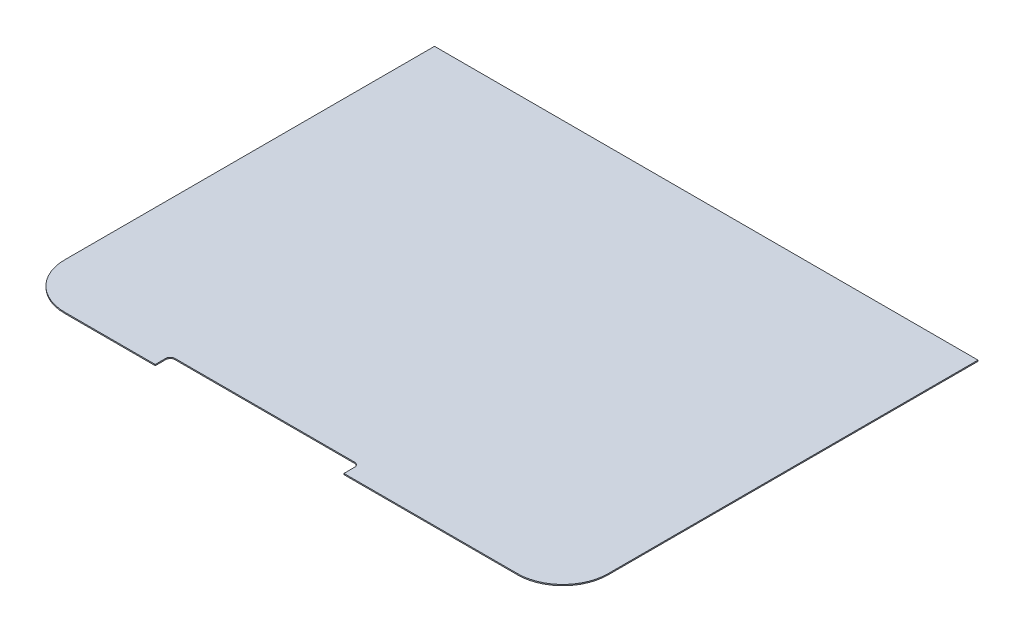
ISO-10303-21;
HEADER;
FILE_DESCRIPTION(('STEP AP214'),'2;1');
FILE_NAME('part.step','',(''),(''),'','','');
FILE_SCHEMA(('AUTOMOTIVE_DESIGN { 1 0 10303 214 1 1 1 1 }'));
ENDSEC;
DATA;
#1=APPLICATION_CONTEXT('core data for automotive mechanical design processes');
#2=APPLICATION_PROTOCOL_DEFINITION('international standard','automotive_design',2000,#1);
#3=PRODUCT_CONTEXT('',#1,'mechanical');
#4=PRODUCT('Part','Part','',(#3));
#5=PRODUCT_RELATED_PRODUCT_CATEGORY('part','',(#4));
#6=PRODUCT_DEFINITION_FORMATION('','',#4);
#7=PRODUCT_DEFINITION_CONTEXT('part definition',#1,'design');
#8=PRODUCT_DEFINITION('design','',#6,#7);
#9=PRODUCT_DEFINITION_SHAPE('','',#8);
#10=(LENGTH_UNIT() NAMED_UNIT(*) SI_UNIT(.MILLI.,.METRE.));
#11=(NAMED_UNIT(*) PLANE_ANGLE_UNIT() SI_UNIT($,.RADIAN.));
#12=(NAMED_UNIT(*) SI_UNIT($,.STERADIAN.) SOLID_ANGLE_UNIT());
#13=UNCERTAINTY_MEASURE_WITH_UNIT(LENGTH_MEASURE(1.E-05),#10,'distance_accuracy_value','');
#14=(GEOMETRIC_REPRESENTATION_CONTEXT(3) GLOBAL_UNCERTAINTY_ASSIGNED_CONTEXT((#13)) GLOBAL_UNIT_ASSIGNED_CONTEXT((#10,
#11,#12)) REPRESENTATION_CONTEXT('',''));
#15=CARTESIAN_POINT('',(0.,0.,0.));
#16=DIRECTION('',(0.,0.,1.));
#17=DIRECTION('',(1.,0.,0.));
#18=AXIS2_PLACEMENT_3D('',#15,#16,#17);
#19=CARTESIAN_POINT('',(150.,-2.50971387345089,-117.5));
#20=DIRECTION('',(-1.,0.,0.));
#21=DIRECTION('',(0.,0.,1.));
#22=AXIS2_PLACEMENT_3D('',#19,#20,#21);
#23=CYLINDRICAL_SURFACE('',#22,1.00971387345089);
#24=CARTESIAN_POINT('',(-150.,-2.50971387345089,-117.5));
#25=DIRECTION('',(1.,0.,0.));
#26=DIRECTION('',(0.,0.,-1.));
#27=AXIS2_PLACEMENT_3D('',#24,#25,#26);
#28=CIRCLE('',#27,1.00971387345089);
#29=CARTESIAN_POINT('',(-150.,-1.5,-117.5));
#30=VERTEX_POINT('',#29);
#31=CARTESIAN_POINT('',(-150.,-2.1643713897353,-116.551179324013));
#32=VERTEX_POINT('',#31);
#33=EDGE_CURVE('E110',#30,#32,#28,.F.);
#34=ORIENTED_EDGE('',*,*,#33,.T.);
#35=DIRECTION('',(-1.,0.,0.));
#36=VECTOR('',#35,1.);
#37=CARTESIAN_POINT('',(150.,-2.1643713897353,-116.551179324013));
#38=LINE('',#37,#36);
#39=CARTESIAN_POINT('',(150.,-2.1643713897353,-116.551179324013));
#40=VERTEX_POINT('',#39);
#41=EDGE_CURVE('E12',#40,#32,#38,.T.);
#42=ORIENTED_EDGE('',*,*,#41,.F.);
#43=CARTESIAN_POINT('',(150.,-2.50971387345089,-117.5));
#44=DIRECTION('',(1.,0.,0.));
#45=DIRECTION('',(0.,0.,-1.));
#46=AXIS2_PLACEMENT_3D('',#43,#44,#45);
#47=CIRCLE('',#46,1.00971387345089);
#48=CARTESIAN_POINT('',(150.,-1.5,-117.5));
#49=VERTEX_POINT('',#48);
#50=EDGE_CURVE('E86',#49,#40,#47,.F.);
#51=ORIENTED_EDGE('',*,*,#50,.F.);
#52=DIRECTION('',(-1.,0.,0.));
#53=VECTOR('',#52,1.);
#54=CARTESIAN_POINT('',(150.,-1.5,-117.5));
#55=LINE('',#54,#53);
#56=EDGE_CURVE('E62',#49,#30,#55,.T.);
#57=ORIENTED_EDGE('',*,*,#56,.T.);
#58=EDGE_LOOP('',(#34,#42,#51,#57));
#59=FACE_BOUND('',#58,.T.);
#60=ADVANCED_FACE('F46',(#59),#23,.F.);
#61=CARTESIAN_POINT('',(150.,-1.90785628224105,-115.846409858424));
#62=DIRECTION('',(0.,0.93969262078591,-0.342020143325665));
#63=DIRECTION('',(0.,0.342020143325665,0.93969262078591));
#64=AXIS2_PLACEMENT_3D('',#61,#62,#63);
#65=PLANE('',#64);
#66=DIRECTION('',(0.,-0.342020143325665,-0.93969262078591));
#67=VECTOR('',#66,1.);
#68=CARTESIAN_POINT('',(-150.,-1.90785628224105,-115.846409858424));
#69=LINE('',#68,#67);
#70=CARTESIAN_POINT('',(-150.,-1.90785628224105,-115.846409858424));
#71=VERTEX_POINT('',#70);
#72=EDGE_CURVE('E103',#71,#32,#69,.T.);
#73=ORIENTED_EDGE('',*,*,#72,.F.);
#74=DIRECTION('',(-1.,0.,0.));
#75=VECTOR('',#74,1.);
#76=CARTESIAN_POINT('',(150.,-1.90785628224105,-115.846409858424));
#77=LINE('',#76,#75);
#78=CARTESIAN_POINT('',(150.,-1.90785628224105,-115.846409858424));
#79=VERTEX_POINT('',#78);
#80=EDGE_CURVE('E54',#79,#71,#77,.T.);
#81=ORIENTED_EDGE('',*,*,#80,.F.);
#82=DIRECTION('',(0.,-0.342020143325665,-0.93969262078591));
#83=VECTOR('',#82,1.);
#84=CARTESIAN_POINT('',(150.,-1.90785628224105,-115.846409858424));
#85=LINE('',#84,#83);
#86=EDGE_CURVE('E97',#79,#40,#85,.T.);
#87=ORIENTED_EDGE('',*,*,#86,.T.);
#88=ORIENTED_EDGE('',*,*,#41,.T.);
#89=EDGE_LOOP('',(#73,#81,#87,#88));
#90=FACE_BOUND('',#89,.T.);
#91=ADVANCED_FACE('F101',(#90),#65,.T.);
#92=CARTESIAN_POINT('',(150.,-2.50971387345089,-117.5));
#93=DIRECTION('',(-1.,0.,0.));
#94=DIRECTION('',(0.,0.,1.));
#95=AXIS2_PLACEMENT_3D('',#92,#93,#94);
#96=CYLINDRICAL_SURFACE('',#95,1.75971387345089);
#97=CARTESIAN_POINT('',(-150.,-2.50971387345089,-117.5));
#98=DIRECTION('',(-1.,0.,0.));
#99=DIRECTION('',(0.,0.,1.));
#100=AXIS2_PLACEMENT_3D('',#97,#98,#99);
#101=CIRCLE('',#100,1.75971387345089);
#102=CARTESIAN_POINT('',(-150.,-0.750000000000003,-117.5));
#103=VERTEX_POINT('',#102);
#104=EDGE_CURVE('E113',#103,#71,#101,.T.);
#105=ORIENTED_EDGE('',*,*,#104,.F.);
#106=DIRECTION('',(-1.,0.,0.));
#107=VECTOR('',#106,1.);
#108=CARTESIAN_POINT('',(150.,-0.750000000000003,-117.5));
#109=LINE('',#108,#107);
#110=CARTESIAN_POINT('',(150.,-0.750000000000003,-117.5));
#111=VERTEX_POINT('',#110);
#112=EDGE_CURVE('E76',#111,#103,#109,.T.);
#113=ORIENTED_EDGE('',*,*,#112,.F.);
#114=CARTESIAN_POINT('',(150.,-2.50971387345089,-117.5));
#115=DIRECTION('',(-1.,0.,0.));
#116=DIRECTION('',(0.,0.,1.));
#117=AXIS2_PLACEMENT_3D('',#114,#115,#116);
#118=CIRCLE('',#117,1.75971387345089);
#119=EDGE_CURVE('E92',#111,#79,#118,.T.);
#120=ORIENTED_EDGE('',*,*,#119,.T.);
#121=ORIENTED_EDGE('',*,*,#80,.T.);
#122=EDGE_LOOP('',(#105,#113,#120,#121));
#123=FACE_BOUND('',#122,.T.);
#124=ADVANCED_FACE('F94',(#123),#96,.T.);
#125=CARTESIAN_POINT('',(150.,-1.5,-117.5));
#126=DIRECTION('',(0.,0.,1.));
#127=DIRECTION('',(1.,0.,0.));
#128=AXIS2_PLACEMENT_3D('',#125,#126,#127);
#129=PLANE('',#128);
#130=DIRECTION('',(0.,1.,0.));
#131=VECTOR('',#130,1.);
#132=CARTESIAN_POINT('',(-150.,-1.5,-117.5));
#133=LINE('',#132,#131);
#134=EDGE_CURVE('E106',#30,#103,#133,.T.);
#135=ORIENTED_EDGE('',*,*,#134,.F.);
#136=ORIENTED_EDGE('',*,*,#56,.F.);
#137=DIRECTION('',(0.,1.,0.));
#138=VECTOR('',#137,1.);
#139=CARTESIAN_POINT('',(150.,-1.5,-117.5));
#140=LINE('',#139,#138);
#141=EDGE_CURVE('E96',#49,#111,#140,.T.);
#142=ORIENTED_EDGE('',*,*,#141,.T.);
#143=ORIENTED_EDGE('',*,*,#112,.T.);
#144=EDGE_LOOP('',(#135,#136,#142,#143));
#145=FACE_BOUND('',#144,.T.);
#146=ADVANCED_FACE('F120',(#145),#129,.T.);
#147=CARTESIAN_POINT('',(150.,-2.50971387345089,-117.5));
#148=DIRECTION('',(1.,0.,0.));
#149=DIRECTION('',(0.,0.,-1.));
#150=AXIS2_PLACEMENT_3D('',#147,#148,#149);
#151=PLANE('',#150);
#152=ORIENTED_EDGE('',*,*,#50,.T.);
#153=ORIENTED_EDGE('',*,*,#86,.F.);
#154=ORIENTED_EDGE('',*,*,#119,.F.);
#155=ORIENTED_EDGE('',*,*,#141,.F.);
#156=EDGE_LOOP('',(#152,#153,#154,#155));
#157=FACE_BOUND('',#156,.T.);
#158=ADVANCED_FACE('F104',(#157),#151,.T.);
#159=CARTESIAN_POINT('',(-150.,-2.50971387345089,-117.5));
#160=DIRECTION('',(1.,0.,0.));
#161=DIRECTION('',(0.,0.,-1.));
#162=AXIS2_PLACEMENT_3D('',#159,#160,#161);
#163=PLANE('',#162);
#164=ORIENTED_EDGE('',*,*,#104,.T.);
#165=ORIENTED_EDGE('',*,*,#72,.T.);
#166=ORIENTED_EDGE('',*,*,#33,.F.);
#167=ORIENTED_EDGE('',*,*,#134,.T.);
#168=EDGE_LOOP('',(#164,#165,#166,#167));
#169=FACE_BOUND('',#168,.T.);
#170=ADVANCED_FACE('F119',(#169),#163,.F.);
#171=CLOSED_SHELL('',(#60,#91,#124,#146,#158,#170));
#172=MANIFOLD_SOLID_BREP('B2',#171);
#173=CARTESIAN_POINT('',(180.,-0.75,157.5));
#174=DIRECTION('',(0.,0.,1.));
#175=DIRECTION('',(1.,0.,0.));
#176=AXIS2_PLACEMENT_3D('',#173,#174,#175);
#177=PLANE('',#176);
#178=DIRECTION('',(0.,1.,0.));
#179=VECTOR('',#178,1.);
#180=CARTESIAN_POINT('',(-90.,-10.,157.5));
#181=LINE('',#180,#179);
#182=CARTESIAN_POINT('',(-90.,-0.750000000000001,157.5));
#183=VERTEX_POINT('',#182);
#184=CARTESIAN_POINT('',(-90.,0.,157.5));
#185=VERTEX_POINT('',#184);
#186=EDGE_CURVE('E345',#183,#185,#181,.T.);
#187=ORIENTED_EDGE('',*,*,#186,.T.);
#188=DIRECTION('',(1.,0.,0.));
#189=VECTOR('',#188,1.);
#190=CARTESIAN_POINT('',(180.,0.,157.5));
#191=LINE('',#190,#189);
#192=CARTESIAN_POINT('',(-150.,0.,157.5));
#193=VERTEX_POINT('',#192);
#194=EDGE_CURVE('E291',#193,#185,#191,.T.);
#195=ORIENTED_EDGE('',*,*,#194,.F.);
#196=DIRECTION('',(0.,1.,0.));
#197=VECTOR('',#196,1.);
#198=CARTESIAN_POINT('',(-150.,-0.75,157.5));
#199=LINE('',#198,#197);
#200=CARTESIAN_POINT('',(-150.,-0.75,157.5));
#201=VERTEX_POINT('',#200);
#202=EDGE_CURVE('E309',#193,#201,#199,.F.);
#203=ORIENTED_EDGE('',*,*,#202,.T.);
#204=DIRECTION('',(1.,0.,0.));
#205=VECTOR('',#204,1.);
#206=CARTESIAN_POINT('',(180.,-0.75,157.5));
#207=LINE('',#206,#205);
#208=EDGE_CURVE('E322',#201,#183,#207,.T.);
#209=ORIENTED_EDGE('',*,*,#208,.T.);
#210=EDGE_LOOP('',(#187,#195,#203,#209));
#211=FACE_BOUND('',#210,.T.);
#212=ADVANCED_FACE('F181',(#211),#177,.T.);
#213=CARTESIAN_POINT('',(-180.,-0.75,157.5));
#214=DIRECTION('',(-1.,0.,0.));
#215=DIRECTION('',(0.,0.,1.));
#216=AXIS2_PLACEMENT_3D('',#213,#214,#215);
#217=PLANE('',#216);
#218=DIRECTION('',(0.,1.,0.));
#219=VECTOR('',#218,1.);
#220=CARTESIAN_POINT('',(-180.,-10.,-117.5));
#221=LINE('',#220,#219);
#222=CARTESIAN_POINT('',(-180.,-0.750000000000001,-117.5));
#223=VERTEX_POINT('',#222);
#224=CARTESIAN_POINT('',(-180.,0.,-117.5));
#225=VERTEX_POINT('',#224);
#226=EDGE_CURVE('E276',#223,#225,#221,.T.);
#227=ORIENTED_EDGE('',*,*,#226,.F.);
#228=DIRECTION('',(0.,0.,1.));
#229=VECTOR('',#228,1.);
#230=CARTESIAN_POINT('',(-180.,-0.75,157.5));
#231=LINE('',#230,#229);
#232=CARTESIAN_POINT('',(-180.,-0.75,127.5));
#233=VERTEX_POINT('',#232);
#234=EDGE_CURVE('E290',#223,#233,#231,.T.);
#235=ORIENTED_EDGE('',*,*,#234,.T.);
#236=DIRECTION('',(0.,1.,0.));
#237=VECTOR('',#236,1.);
#238=CARTESIAN_POINT('',(-180.,-0.75,127.5));
#239=LINE('',#238,#237);
#240=CARTESIAN_POINT('',(-180.,0.,127.5));
#241=VERTEX_POINT('',#240);
#242=EDGE_CURVE('E300',#233,#241,#239,.T.);
#243=ORIENTED_EDGE('',*,*,#242,.T.);
#244=DIRECTION('',(0.,0.,1.));
#245=VECTOR('',#244,1.);
#246=CARTESIAN_POINT('',(-180.,0.,157.5));
#247=LINE('',#246,#245);
#248=EDGE_CURVE('E329',#225,#241,#247,.T.);
#249=ORIENTED_EDGE('',*,*,#248,.F.);
#250=EDGE_LOOP('',(#227,#235,#243,#249));
#251=FACE_BOUND('',#250,.T.);
#252=ADVANCED_FACE('F328',(#251),#217,.T.);
#253=CARTESIAN_POINT('',(180.,-0.75,157.5));
#254=DIRECTION('',(1.,0.,0.));
#255=DIRECTION('',(0.,0.,-1.));
#256=AXIS2_PLACEMENT_3D('',#253,#254,#255);
#257=PLANE('',#256);
#258=DIRECTION('',(0.,1.,0.));
#259=VECTOR('',#258,1.);
#260=CARTESIAN_POINT('',(180.,-10.,-117.5));
#261=LINE('',#260,#259);
#262=CARTESIAN_POINT('',(180.,-0.750000000000001,-117.5));
#263=VERTEX_POINT('',#262);
#264=CARTESIAN_POINT('',(180.,0.,-117.5));
#265=VERTEX_POINT('',#264);
#266=EDGE_CURVE('E274',#263,#265,#261,.T.);
#267=ORIENTED_EDGE('',*,*,#266,.T.);
#268=DIRECTION('',(0.,0.,-1.));
#269=VECTOR('',#268,1.);
#270=CARTESIAN_POINT('',(180.,0.,157.5));
#271=LINE('',#270,#269);
#272=CARTESIAN_POINT('',(180.,0.,127.5));
#273=VERTEX_POINT('',#272);
#274=EDGE_CURVE('E284',#273,#265,#271,.T.);
#275=ORIENTED_EDGE('',*,*,#274,.F.);
#276=DIRECTION('',(0.,1.,0.));
#277=VECTOR('',#276,1.);
#278=CARTESIAN_POINT('',(180.,-0.75,127.5));
#279=LINE('',#278,#277);
#280=CARTESIAN_POINT('',(180.,-0.75,127.5));
#281=VERTEX_POINT('',#280);
#282=EDGE_CURVE('E44',#273,#281,#279,.F.);
#283=ORIENTED_EDGE('',*,*,#282,.T.);
#284=DIRECTION('',(0.,0.,-1.));
#285=VECTOR('',#284,1.);
#286=CARTESIAN_POINT('',(180.,-0.75,157.5));
#287=LINE('',#286,#285);
#288=EDGE_CURVE('E285',#281,#263,#287,.T.);
#289=ORIENTED_EDGE('',*,*,#288,.T.);
#290=EDGE_LOOP('',(#267,#275,#283,#289));
#291=FACE_BOUND('',#290,.T.);
#292=ADVANCED_FACE('F283',(#291),#257,.T.);
#293=DIRECTION('',(0.,1.,0.));
#294=VECTOR('',#293,1.);
#295=CARTESIAN_POINT('',(35.,-10.,157.5));
#296=LINE('',#295,#294);
#297=CARTESIAN_POINT('',(35.,-0.750000000000001,157.5));
#298=VERTEX_POINT('',#297);
#299=CARTESIAN_POINT('',(35.0000000000001,0.,157.5));
#300=VERTEX_POINT('',#299);
#301=EDGE_CURVE('E196',#298,#300,#296,.T.);
#302=ORIENTED_EDGE('',*,*,#301,.F.);
#303=CARTESIAN_POINT('',(150.,-0.75,157.5));
#304=VERTEX_POINT('',#303);
#305=EDGE_CURVE('E293',#298,#304,#207,.T.);
#306=ORIENTED_EDGE('',*,*,#305,.T.);
#307=DIRECTION('',(0.,1.,0.));
#308=VECTOR('',#307,1.);
#309=CARTESIAN_POINT('',(150.,-0.75,157.5));
#310=LINE('',#309,#308);
#311=CARTESIAN_POINT('',(150.,0.,157.5));
#312=VERTEX_POINT('',#311);
#313=EDGE_CURVE('E306',#304,#312,#310,.T.);
#314=ORIENTED_EDGE('',*,*,#313,.T.);
#315=EDGE_CURVE('E296',#300,#312,#191,.T.);
#316=ORIENTED_EDGE('',*,*,#315,.F.);
#317=EDGE_LOOP('',(#302,#306,#314,#316));
#318=FACE_BOUND('',#317,.T.);
#319=ADVANCED_FACE('F378',(#318),#177,.T.);
#320=CARTESIAN_POINT('',(0.,-0.75,0.));
#321=DIRECTION('',(0.,1.,0.));
#322=DIRECTION('',(0.,0.,1.));
#323=AXIS2_PLACEMENT_3D('',#320,#321,#322);
#324=PLANE('',#323);
#325=DIRECTION('',(1.,0.,0.));
#326=VECTOR('',#325,1.);
#327=CARTESIAN_POINT('',(0.,-0.75,-117.5));
#328=LINE('',#327,#326);
#329=EDGE_CURVE('E280',#223,#263,#328,.T.);
#330=ORIENTED_EDGE('',*,*,#329,.T.);
#331=ORIENTED_EDGE('',*,*,#288,.F.);
#332=CARTESIAN_POINT('',(150.,-0.75,127.5));
#333=DIRECTION('',(0.,1.,0.));
#334=DIRECTION('',(0.,0.,1.));
#335=AXIS2_PLACEMENT_3D('',#332,#333,#334);
#336=CIRCLE('',#335,30.);
#337=EDGE_CURVE('E311',#281,#304,#336,.F.);
#338=ORIENTED_EDGE('',*,*,#337,.T.);
#339=ORIENTED_EDGE('',*,*,#305,.F.);
#340=DIRECTION('',(0.,0.,-1.));
#341=VECTOR('',#340,1.);
#342=CARTESIAN_POINT('',(35.,-0.75,0.));
#343=LINE('',#342,#341);
#344=CARTESIAN_POINT('',(35.,-0.750000000000001,150.5));
#345=VERTEX_POINT('',#344);
#346=EDGE_CURVE('E348',#298,#345,#343,.T.);
#347=ORIENTED_EDGE('',*,*,#346,.T.);
#348=CARTESIAN_POINT('',(32.,-0.750000000000001,150.5));
#349=DIRECTION('',(0.,1.,0.));
#350=DIRECTION('',(0.,0.,1.));
#351=AXIS2_PLACEMENT_3D('',#348,#349,#350);
#352=CIRCLE('',#351,3.);
#353=CARTESIAN_POINT('',(32.,-0.750000000000001,147.5));
#354=VERTEX_POINT('',#353);
#355=EDGE_CURVE('E360',#345,#354,#352,.T.);
#356=ORIENTED_EDGE('',*,*,#355,.T.);
#357=DIRECTION('',(-1.,0.,0.));
#358=VECTOR('',#357,1.);
#359=CARTESIAN_POINT('',(0.,-0.75,147.5));
#360=LINE('',#359,#358);
#361=CARTESIAN_POINT('',(-87.,-0.750000000000001,147.5));
#362=VERTEX_POINT('',#361);
#363=EDGE_CURVE('E363',#354,#362,#360,.T.);
#364=ORIENTED_EDGE('',*,*,#363,.T.);
#365=CARTESIAN_POINT('',(-87.,-0.750000000000001,150.5));
#366=DIRECTION('',(0.,1.,0.));
#367=DIRECTION('',(0.,0.,1.));
#368=AXIS2_PLACEMENT_3D('',#365,#366,#367);
#369=CIRCLE('',#368,3.);
#370=CARTESIAN_POINT('',(-90.,-0.750000000000001,150.5));
#371=VERTEX_POINT('',#370);
#372=EDGE_CURVE('E366',#362,#371,#369,.T.);
#373=ORIENTED_EDGE('',*,*,#372,.T.);
#374=DIRECTION('',(0.,0.,1.));
#375=VECTOR('',#374,1.);
#376=CARTESIAN_POINT('',(-90.,-0.75,0.));
#377=LINE('',#376,#375);
#378=EDGE_CURVE('E281',#371,#183,#377,.T.);
#379=ORIENTED_EDGE('',*,*,#378,.T.);
#380=ORIENTED_EDGE('',*,*,#208,.F.);
#381=CARTESIAN_POINT('',(-150.,-0.75,127.5));
#382=DIRECTION('',(0.,1.,0.));
#383=DIRECTION('',(0.,0.,1.));
#384=AXIS2_PLACEMENT_3D('',#381,#382,#383);
#385=CIRCLE('',#384,30.);
#386=EDGE_CURVE('E189',#201,#233,#385,.F.);
#387=ORIENTED_EDGE('',*,*,#386,.T.);
#388=ORIENTED_EDGE('',*,*,#234,.F.);
#389=EDGE_LOOP('',(#330,#331,#338,#339,#347,#356,#364,#373,#379,#380,#387,#388));
#390=FACE_BOUND('',#389,.T.);
#391=ADVANCED_FACE('F319',(#390),#324,.F.);
#392=CARTESIAN_POINT('',(0.,0.,0.));
#393=DIRECTION('',(0.,1.,0.));
#394=DIRECTION('',(0.,0.,1.));
#395=AXIS2_PLACEMENT_3D('',#392,#393,#394);
#396=PLANE('',#395);
#397=ORIENTED_EDGE('',*,*,#274,.T.);
#398=DIRECTION('',(1.,0.,0.));
#399=VECTOR('',#398,1.);
#400=CARTESIAN_POINT('',(-150.,0.,-117.5));
#401=LINE('',#400,#399);
#402=EDGE_CURVE('E271',#225,#265,#401,.T.);
#403=ORIENTED_EDGE('',*,*,#402,.F.);
#404=ORIENTED_EDGE('',*,*,#248,.T.);
#405=CARTESIAN_POINT('',(-150.,0.,127.5));
#406=DIRECTION('',(0.,1.,0.));
#407=DIRECTION('',(0.,0.,1.));
#408=AXIS2_PLACEMENT_3D('',#405,#406,#407);
#409=CIRCLE('',#408,30.);
#410=EDGE_CURVE('E304',#241,#193,#409,.T.);
#411=ORIENTED_EDGE('',*,*,#410,.T.);
#412=ORIENTED_EDGE('',*,*,#194,.T.);
#413=DIRECTION('',(0.,0.,1.));
#414=VECTOR('',#413,1.);
#415=CARTESIAN_POINT('',(-90.,0.,157.5));
#416=LINE('',#415,#414);
#417=CARTESIAN_POINT('',(-90.,0.,150.5));
#418=VERTEX_POINT('',#417);
#419=EDGE_CURVE('E343',#418,#185,#416,.T.);
#420=ORIENTED_EDGE('',*,*,#419,.F.);
#421=CARTESIAN_POINT('',(-87.,0.,150.5));
#422=DIRECTION('',(0.,1.,0.));
#423=DIRECTION('',(0.,0.,-1.));
#424=AXIS2_PLACEMENT_3D('',#421,#422,#423);
#425=CIRCLE('',#424,3.);
#426=CARTESIAN_POINT('',(-87.,0.,147.5));
#427=VERTEX_POINT('',#426);
#428=EDGE_CURVE('E340',#427,#418,#425,.T.);
#429=ORIENTED_EDGE('',*,*,#428,.F.);
#430=DIRECTION('',(-1.,0.,0.));
#431=VECTOR('',#430,1.);
#432=CARTESIAN_POINT('',(-87.,0.,147.5));
#433=LINE('',#432,#431);
#434=CARTESIAN_POINT('',(32.,0.,147.5));
#435=VERTEX_POINT('',#434);
#436=EDGE_CURVE('E337',#435,#427,#433,.T.);
#437=ORIENTED_EDGE('',*,*,#436,.F.);
#438=CARTESIAN_POINT('',(32.,0.,150.5));
#439=DIRECTION('',(0.,1.,0.));
#440=DIRECTION('',(0.,0.,-1.));
#441=AXIS2_PLACEMENT_3D('',#438,#439,#440);
#442=CIRCLE('',#441,3.);
#443=CARTESIAN_POINT('',(35.,0.,150.5));
#444=VERTEX_POINT('',#443);
#445=EDGE_CURVE('E332',#444,#435,#442,.T.);
#446=ORIENTED_EDGE('',*,*,#445,.F.);
#447=DIRECTION('',(0.,0.,-1.));
#448=VECTOR('',#447,1.);
#449=CARTESIAN_POINT('',(35.,0.,150.5));
#450=LINE('',#449,#448);
#451=EDGE_CURVE('E330',#300,#444,#450,.T.);
#452=ORIENTED_EDGE('',*,*,#451,.F.);
#453=ORIENTED_EDGE('',*,*,#315,.T.);
#454=CARTESIAN_POINT('',(150.,0.,127.5));
#455=DIRECTION('',(0.,1.,0.));
#456=DIRECTION('',(0.,0.,1.));
#457=AXIS2_PLACEMENT_3D('',#454,#455,#456);
#458=CIRCLE('',#457,30.);
#459=EDGE_CURVE('E289',#312,#273,#458,.T.);
#460=ORIENTED_EDGE('',*,*,#459,.T.);
#461=EDGE_LOOP('',(#397,#403,#404,#411,#412,#420,#429,#437,#446,#452,#453,#460));
#462=FACE_BOUND('',#461,.T.);
#463=ADVANCED_FACE('F287',(#462),#396,.T.);
#464=CARTESIAN_POINT('',(-150.,-0.75,127.5));
#465=DIRECTION('',(0.,1.,0.));
#466=DIRECTION('',(0.,0.,1.));
#467=AXIS2_PLACEMENT_3D('',#464,#465,#466);
#468=CYLINDRICAL_SURFACE('',#467,30.);
#469=ORIENTED_EDGE('',*,*,#386,.F.);
#470=ORIENTED_EDGE('',*,*,#202,.F.);
#471=ORIENTED_EDGE('',*,*,#410,.F.);
#472=ORIENTED_EDGE('',*,*,#242,.F.);
#473=EDGE_LOOP('',(#469,#470,#471,#472));
#474=FACE_BOUND('',#473,.T.);
#475=ADVANCED_FACE('F326',(#474),#468,.T.);
#476=CARTESIAN_POINT('',(150.,-0.75,127.5));
#477=DIRECTION('',(0.,1.,0.));
#478=DIRECTION('',(0.,0.,1.));
#479=AXIS2_PLACEMENT_3D('',#476,#477,#478);
#480=CYLINDRICAL_SURFACE('',#479,30.);
#481=ORIENTED_EDGE('',*,*,#337,.F.);
#482=ORIENTED_EDGE('',*,*,#282,.F.);
#483=ORIENTED_EDGE('',*,*,#459,.F.);
#484=ORIENTED_EDGE('',*,*,#313,.F.);
#485=EDGE_LOOP('',(#481,#482,#483,#484));
#486=FACE_BOUND('',#485,.T.);
#487=ADVANCED_FACE('F183',(#486),#480,.T.);
#488=CARTESIAN_POINT('',(-150.,-10.,-117.5));
#489=DIRECTION('',(0.,0.,1.));
#490=DIRECTION('',(1.,0.,0.));
#491=AXIS2_PLACEMENT_3D('',#488,#489,#490);
#492=PLANE('',#491);
#493=ORIENTED_EDGE('',*,*,#329,.F.);
#494=ORIENTED_EDGE('',*,*,#226,.T.);
#495=ORIENTED_EDGE('',*,*,#402,.T.);
#496=ORIENTED_EDGE('',*,*,#266,.F.);
#497=EDGE_LOOP('',(#493,#494,#495,#496));
#498=FACE_BOUND('',#497,.T.);
#499=ADVANCED_FACE('F273',(#498),#492,.F.);
#500=CARTESIAN_POINT('',(-90.,-10.,157.5));
#501=DIRECTION('',(-1.,0.,0.));
#502=DIRECTION('',(0.,0.,1.));
#503=AXIS2_PLACEMENT_3D('',#500,#501,#502);
#504=PLANE('',#503);
#505=DIRECTION('',(0.,1.,0.));
#506=VECTOR('',#505,1.);
#507=CARTESIAN_POINT('',(-90.,-10.,150.5));
#508=LINE('',#507,#506);
#509=EDGE_CURVE('E349',#371,#418,#508,.T.);
#510=ORIENTED_EDGE('',*,*,#509,.T.);
#511=ORIENTED_EDGE('',*,*,#419,.T.);
#512=ORIENTED_EDGE('',*,*,#186,.F.);
#513=ORIENTED_EDGE('',*,*,#378,.F.);
#514=EDGE_LOOP('',(#510,#511,#512,#513));
#515=FACE_BOUND('',#514,.T.);
#516=ADVANCED_FACE('F395',(#515),#504,.F.);
#517=CARTESIAN_POINT('',(-87.,-10.,150.5));
#518=DIRECTION('',(0.,1.,0.));
#519=DIRECTION('',(0.,0.,1.));
#520=AXIS2_PLACEMENT_3D('',#517,#518,#519);
#521=CYLINDRICAL_SURFACE('',#520,3.);
#522=DIRECTION('',(0.,1.,0.));
#523=VECTOR('',#522,1.);
#524=CARTESIAN_POINT('',(-87.,-10.,147.5));
#525=LINE('',#524,#523);
#526=EDGE_CURVE('E351',#362,#427,#525,.T.);
#527=ORIENTED_EDGE('',*,*,#526,.T.);
#528=ORIENTED_EDGE('',*,*,#428,.T.);
#529=ORIENTED_EDGE('',*,*,#509,.F.);
#530=ORIENTED_EDGE('',*,*,#372,.F.);
#531=EDGE_LOOP('',(#527,#528,#529,#530));
#532=FACE_BOUND('',#531,.T.);
#533=ADVANCED_FACE('F392',(#532),#521,.F.);
#534=CARTESIAN_POINT('',(-87.,-10.,147.5));
#535=DIRECTION('',(0.,0.,-1.));
#536=DIRECTION('',(-1.,0.,0.));
#537=AXIS2_PLACEMENT_3D('',#534,#535,#536);
#538=PLANE('',#537);
#539=DIRECTION('',(0.,1.,0.));
#540=VECTOR('',#539,1.);
#541=CARTESIAN_POINT('',(32.,-10.,147.5));
#542=LINE('',#541,#540);
#543=EDGE_CURVE('E353',#354,#435,#542,.T.);
#544=ORIENTED_EDGE('',*,*,#543,.T.);
#545=ORIENTED_EDGE('',*,*,#436,.T.);
#546=ORIENTED_EDGE('',*,*,#526,.F.);
#547=ORIENTED_EDGE('',*,*,#363,.F.);
#548=EDGE_LOOP('',(#544,#545,#546,#547));
#549=FACE_BOUND('',#548,.T.);
#550=ADVANCED_FACE('F387',(#549),#538,.F.);
#551=CARTESIAN_POINT('',(32.,-10.,150.5));
#552=DIRECTION('',(0.,1.,0.));
#553=DIRECTION('',(0.,0.,1.));
#554=AXIS2_PLACEMENT_3D('',#551,#552,#553);
#555=CYLINDRICAL_SURFACE('',#554,3.);
#556=DIRECTION('',(0.,1.,0.));
#557=VECTOR('',#556,1.);
#558=CARTESIAN_POINT('',(35.,-10.,150.5));
#559=LINE('',#558,#557);
#560=EDGE_CURVE('E355',#345,#444,#559,.T.);
#561=ORIENTED_EDGE('',*,*,#560,.T.);
#562=ORIENTED_EDGE('',*,*,#445,.T.);
#563=ORIENTED_EDGE('',*,*,#543,.F.);
#564=ORIENTED_EDGE('',*,*,#355,.F.);
#565=EDGE_LOOP('',(#561,#562,#563,#564));
#566=FACE_BOUND('',#565,.T.);
#567=ADVANCED_FACE('F383',(#566),#555,.F.);
#568=CARTESIAN_POINT('',(35.,-10.,150.5));
#569=DIRECTION('',(1.,0.,0.));
#570=DIRECTION('',(0.,0.,-1.));
#571=AXIS2_PLACEMENT_3D('',#568,#569,#570);
#572=PLANE('',#571);
#573=ORIENTED_EDGE('',*,*,#301,.T.);
#574=ORIENTED_EDGE('',*,*,#451,.T.);
#575=ORIENTED_EDGE('',*,*,#560,.F.);
#576=ORIENTED_EDGE('',*,*,#346,.F.);
#577=EDGE_LOOP('',(#573,#574,#575,#576));
#578=FACE_BOUND('',#577,.T.);
#579=ADVANCED_FACE('F381',(#578),#572,.F.);
#580=CLOSED_SHELL('',(#212,#252,#292,#319,#391,#463,#475,#487,#499,#516,#533,#550,#567,#579));
#581=MANIFOLD_SOLID_BREP('B6',#580);
#582=ADVANCED_BREP_SHAPE_REPRESENTATION('',(#18,#172,#581),#14);
#583=SHAPE_DEFINITION_REPRESENTATION(#9,#582);
ENDSEC;
END-ISO-10303-21;
